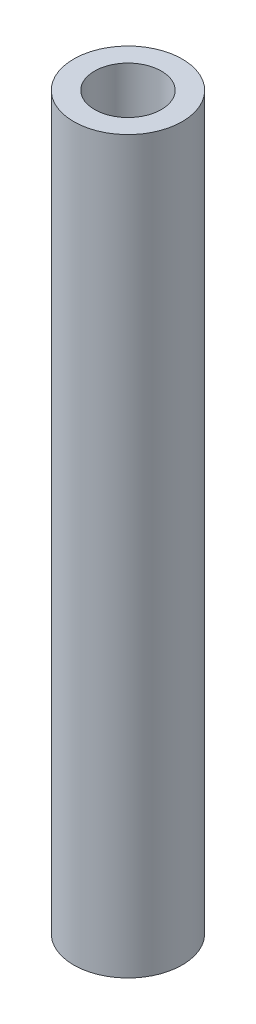
ISO-10303-21;
HEADER;
FILE_DESCRIPTION(('STEP AP214'),'2;1');
FILE_NAME('part.step','',(''),(''),'','','');
FILE_SCHEMA(('AUTOMOTIVE_DESIGN { 1 0 10303 214 1 1 1 1 }'));
ENDSEC;
DATA;
#1=APPLICATION_CONTEXT('core data for automotive mechanical design processes');
#2=APPLICATION_PROTOCOL_DEFINITION('international standard','automotive_design',2000,#1);
#3=PRODUCT_CONTEXT('',#1,'mechanical');
#4=PRODUCT('Part','Part','',(#3));
#5=PRODUCT_RELATED_PRODUCT_CATEGORY('part','',(#4));
#6=PRODUCT_DEFINITION_FORMATION('','',#4);
#7=PRODUCT_DEFINITION_CONTEXT('part definition',#1,'design');
#8=PRODUCT_DEFINITION('design','',#6,#7);
#9=PRODUCT_DEFINITION_SHAPE('','',#8);
#10=(LENGTH_UNIT() NAMED_UNIT(*) SI_UNIT(.MILLI.,.METRE.));
#11=(NAMED_UNIT(*) PLANE_ANGLE_UNIT() SI_UNIT($,.RADIAN.));
#12=(NAMED_UNIT(*) SI_UNIT($,.STERADIAN.) SOLID_ANGLE_UNIT());
#13=UNCERTAINTY_MEASURE_WITH_UNIT(LENGTH_MEASURE(1.E-05),#10,'distance_accuracy_value','');
#14=(GEOMETRIC_REPRESENTATION_CONTEXT(3) GLOBAL_UNCERTAINTY_ASSIGNED_CONTEXT((#13)) GLOBAL_UNIT_ASSIGNED_CONTEXT((#10,
#11,#12)) REPRESENTATION_CONTEXT('',''));
#15=CARTESIAN_POINT('',(0.,0.,0.));
#16=DIRECTION('',(0.,0.,1.));
#17=DIRECTION('',(1.,0.,0.));
#18=AXIS2_PLACEMENT_3D('',#15,#16,#17);
#19=CARTESIAN_POINT('',(-20.,38.,-25.));
#20=DIRECTION('',(0.,1.,0.));
#21=DIRECTION('',(0.,0.,1.));
#22=AXIS2_PLACEMENT_3D('',#19,#20,#21);
#23=PLANE('',#22);
#24=CARTESIAN_POINT('',(-20.,38.,-25.));
#25=DIRECTION('',(0.,1.,0.));
#26=DIRECTION('',(0.,0.,1.));
#27=AXIS2_PLACEMENT_3D('',#24,#25,#26);
#28=CIRCLE('',#27,2.6);
#29=CARTESIAN_POINT('',(-20.,38.,-22.4));
#30=VERTEX_POINT('',#29);
#31=EDGE_CURVE('E10',#30,#30,#28,.T.);
#32=ORIENTED_EDGE('',*,*,#31,.T.);
#33=EDGE_LOOP('',(#32));
#34=FACE_BOUND('',#33,.T.);
#35=CARTESIAN_POINT('',(-20.,38.,-25.));
#36=DIRECTION('',(0.,1.,0.));
#37=DIRECTION('',(0.,0.,1.));
#38=AXIS2_PLACEMENT_3D('',#35,#36,#37);
#39=CIRCLE('',#38,1.6);
#40=CARTESIAN_POINT('',(-20.,38.,-23.4));
#41=VERTEX_POINT('',#40);
#42=EDGE_CURVE('E42',#41,#41,#39,.T.);
#43=ORIENTED_EDGE('',*,*,#42,.F.);
#44=EDGE_LOOP('',(#43));
#45=FACE_BOUND('',#44,.T.);
#46=ADVANCED_FACE('F31',(#34,#45),#23,.T.);
#47=CARTESIAN_POINT('',(-20.,3.,-25.));
#48=DIRECTION('',(0.,1.,0.));
#49=DIRECTION('',(0.,0.,1.));
#50=AXIS2_PLACEMENT_3D('',#47,#48,#49);
#51=PLANE('',#50);
#52=CARTESIAN_POINT('',(-20.,3.,-25.));
#53=DIRECTION('',(0.,1.,0.));
#54=DIRECTION('',(0.,0.,1.));
#55=AXIS2_PLACEMENT_3D('',#52,#53,#54);
#56=CIRCLE('',#55,2.6);
#57=CARTESIAN_POINT('',(-20.,3.,-22.4));
#58=VERTEX_POINT('',#57);
#59=EDGE_CURVE('E35',#58,#58,#56,.T.);
#60=ORIENTED_EDGE('',*,*,#59,.F.);
#61=EDGE_LOOP('',(#60));
#62=FACE_BOUND('',#61,.T.);
#63=CARTESIAN_POINT('',(-20.,3.,-25.));
#64=DIRECTION('',(0.,1.,0.));
#65=DIRECTION('',(0.,0.,1.));
#66=AXIS2_PLACEMENT_3D('',#63,#64,#65);
#67=CIRCLE('',#66,1.6);
#68=CARTESIAN_POINT('',(-20.,3.,-23.4));
#69=VERTEX_POINT('',#68);
#70=EDGE_CURVE('E44',#69,#69,#67,.T.);
#71=ORIENTED_EDGE('',*,*,#70,.T.);
#72=EDGE_LOOP('',(#71));
#73=FACE_BOUND('',#72,.T.);
#74=ADVANCED_FACE('F54',(#62,#73),#51,.F.);
#75=CARTESIAN_POINT('',(-20.,38.,-25.));
#76=DIRECTION('',(0.,-1.,0.));
#77=DIRECTION('',(0.,0.,-1.));
#78=AXIS2_PLACEMENT_3D('',#75,#76,#77);
#79=CYLINDRICAL_SURFACE('',#78,2.6);
#80=ORIENTED_EDGE('',*,*,#31,.F.);
#81=EDGE_LOOP('',(#80));
#82=FACE_BOUND('',#81,.T.);
#83=ORIENTED_EDGE('',*,*,#59,.T.);
#84=EDGE_LOOP('',(#83));
#85=FACE_BOUND('',#84,.T.);
#86=ADVANCED_FACE('F33',(#82,#85),#79,.T.);
#87=CARTESIAN_POINT('',(-20.,38.,-25.));
#88=DIRECTION('',(0.,-1.,0.));
#89=DIRECTION('',(0.,0.,-1.));
#90=AXIS2_PLACEMENT_3D('',#87,#88,#89);
#91=CYLINDRICAL_SURFACE('',#90,1.6);
#92=ORIENTED_EDGE('',*,*,#42,.T.);
#93=EDGE_LOOP('',(#92));
#94=FACE_BOUND('',#93,.T.);
#95=ORIENTED_EDGE('',*,*,#70,.F.);
#96=EDGE_LOOP('',(#95));
#97=FACE_BOUND('',#96,.T.);
#98=ADVANCED_FACE('F50',(#94,#97),#91,.F.);
#99=CLOSED_SHELL('',(#46,#74,#86,#98));
#100=MANIFOLD_SOLID_BREP('B2',#99);
#101=ADVANCED_BREP_SHAPE_REPRESENTATION('',(#18,#100),#14);
#102=SHAPE_DEFINITION_REPRESENTATION(#9,#101);
ENDSEC;
END-ISO-10303-21;
